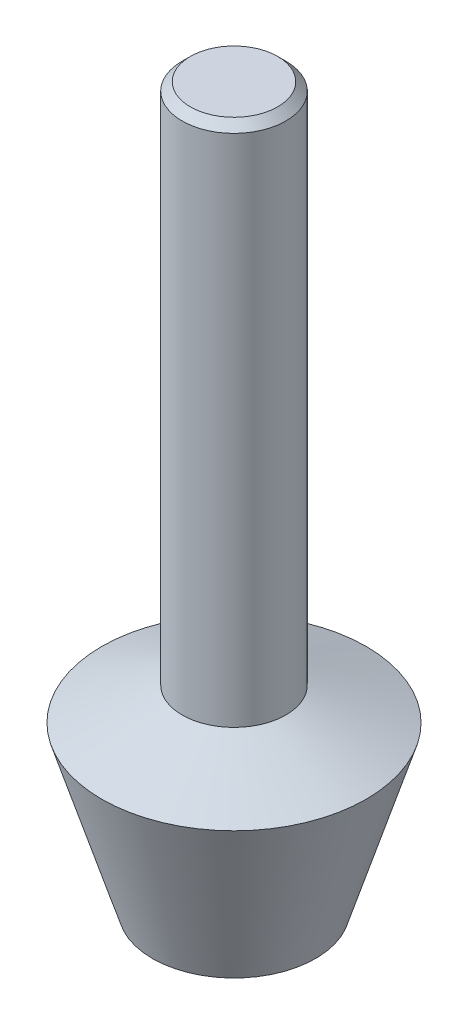
ISO-10303-21;
HEADER;
FILE_DESCRIPTION(('STEP AP214'),'2;1');
FILE_NAME('part.step','',(''),(''),'','','');
FILE_SCHEMA(('AUTOMOTIVE_DESIGN { 1 0 10303 214 1 1 1 1 }'));
ENDSEC;
DATA;
#1=APPLICATION_CONTEXT('core data for automotive mechanical design processes');
#2=APPLICATION_PROTOCOL_DEFINITION('international standard','automotive_design',2000,#1);
#3=PRODUCT_CONTEXT('',#1,'mechanical');
#4=PRODUCT('Part','Part','',(#3));
#5=PRODUCT_RELATED_PRODUCT_CATEGORY('part','',(#4));
#6=PRODUCT_DEFINITION_FORMATION('','',#4);
#7=PRODUCT_DEFINITION_CONTEXT('part definition',#1,'design');
#8=PRODUCT_DEFINITION('design','',#6,#7);
#9=PRODUCT_DEFINITION_SHAPE('','',#8);
#10=(LENGTH_UNIT() NAMED_UNIT(*) SI_UNIT(.MILLI.,.METRE.));
#11=(NAMED_UNIT(*) PLANE_ANGLE_UNIT() SI_UNIT($,.RADIAN.));
#12=(NAMED_UNIT(*) SI_UNIT($,.STERADIAN.) SOLID_ANGLE_UNIT());
#13=UNCERTAINTY_MEASURE_WITH_UNIT(LENGTH_MEASURE(1.E-05),#10,'distance_accuracy_value','');
#14=(GEOMETRIC_REPRESENTATION_CONTEXT(3) GLOBAL_UNCERTAINTY_ASSIGNED_CONTEXT((#13)) GLOBAL_UNIT_ASSIGNED_CONTEXT((#10,
#11,#12)) REPRESENTATION_CONTEXT('',''));
#15=CARTESIAN_POINT('',(0.,0.,0.));
#16=DIRECTION('',(0.,0.,1.));
#17=DIRECTION('',(1.,0.,0.));
#18=AXIS2_PLACEMENT_3D('',#15,#16,#17);
#19=CARTESIAN_POINT('',(-5.06,0.,5.06));
#20=DIRECTION('',(0.,-1.,0.));
#21=DIRECTION('',(0.,0.,-1.));
#22=AXIS2_PLACEMENT_3D('',#19,#20,#21);
#23=PLANE('',#22);
#24=CARTESIAN_POINT('',(0.,0.,0.));
#25=DIRECTION('',(0.,1.,0.));
#26=DIRECTION('',(0.,0.,1.));
#27=AXIS2_PLACEMENT_3D('',#24,#25,#26);
#28=CIRCLE('',#27,5.);
#29=CARTESIAN_POINT('',(0.,0.,5.));
#30=VERTEX_POINT('',#29);
#31=EDGE_CURVE('E18',#30,#30,#28,.F.);
#32=ORIENTED_EDGE('',*,*,#31,.T.);
#33=EDGE_LOOP('',(#32));
#34=FACE_BOUND('',#33,.T.);
#35=ADVANCED_FACE('F14',(#34),#23,.T.);
#36=CARTESIAN_POINT('',(0.,0.,0.));
#37=DIRECTION('',(0.,1.,0.));
#38=DIRECTION('',(0.,0.,1.));
#39=AXIS2_PLACEMENT_3D('',#36,#37,#38);
#40=CONICAL_SURFACE('',#39,5.,0.300605670042395);
#41=CARTESIAN_POINT('',(0.,10.,0.));
#42=DIRECTION('',(0.,-1.,0.));
#43=DIRECTION('',(0.,0.,-1.));
#44=AXIS2_PLACEMENT_3D('',#41,#42,#43);
#45=CIRCLE('',#44,8.1);
#46=CARTESIAN_POINT('',(0.,10.,-8.1));
#47=VERTEX_POINT('',#46);
#48=EDGE_CURVE('E29',#47,#47,#45,.T.);
#49=ORIENTED_EDGE('',*,*,#48,.T.);
#50=EDGE_LOOP('',(#49));
#51=FACE_BOUND('',#50,.T.);
#52=ORIENTED_EDGE('',*,*,#31,.F.);
#53=EDGE_LOOP('',(#52));
#54=FACE_BOUND('',#53,.T.);
#55=ADVANCED_FACE('F54',(#51,#54),#40,.T.);
#56=CARTESIAN_POINT('',(0.,12.,0.));
#57=DIRECTION('',(0.,-1.,0.));
#58=DIRECTION('',(0.,0.,-1.));
#59=AXIS2_PLACEMENT_3D('',#56,#57,#58);
#60=CONICAL_SURFACE('',#59,3.175,1.18504982297332);
#61=ORIENTED_EDGE('',*,*,#48,.F.);
#62=EDGE_LOOP('',(#61));
#63=FACE_BOUND('',#62,.T.);
#64=CARTESIAN_POINT('',(0.,12.,0.));
#65=DIRECTION('',(0.,-1.,0.));
#66=DIRECTION('',(0.,0.,-1.));
#67=AXIS2_PLACEMENT_3D('',#64,#65,#66);
#68=CIRCLE('',#67,3.175);
#69=CARTESIAN_POINT('',(0.,12.,-3.175));
#70=VERTEX_POINT('',#69);
#71=EDGE_CURVE('E26',#70,#70,#68,.T.);
#72=ORIENTED_EDGE('',*,*,#71,.T.);
#73=EDGE_LOOP('',(#72));
#74=FACE_BOUND('',#73,.T.);
#75=ADVANCED_FACE('F35',(#63,#74),#60,.T.);
#76=CARTESIAN_POINT('',(0.,43.5,0.));
#77=DIRECTION('',(0.,-1.,0.));
#78=DIRECTION('',(0.,0.,-1.));
#79=AXIS2_PLACEMENT_3D('',#76,#77,#78);
#80=CYLINDRICAL_SURFACE('',#79,3.175);
#81=ORIENTED_EDGE('',*,*,#71,.F.);
#82=EDGE_LOOP('',(#81));
#83=FACE_BOUND('',#82,.T.);
#84=CARTESIAN_POINT('',(0.,43.5000000000001,0.));
#85=DIRECTION('',(0.,-1.,0.));
#86=DIRECTION('',(0.,0.,-1.));
#87=AXIS2_PLACEMENT_3D('',#84,#85,#86);
#88=CIRCLE('',#87,3.175);
#89=CARTESIAN_POINT('',(0.,43.5,-3.175));
#90=VERTEX_POINT('',#89);
#91=EDGE_CURVE('E22',#90,#90,#88,.T.);
#92=ORIENTED_EDGE('',*,*,#91,.T.);
#93=EDGE_LOOP('',(#92));
#94=FACE_BOUND('',#93,.T.);
#95=ADVANCED_FACE('F37',(#83,#94),#80,.T.);
#96=CARTESIAN_POINT('',(-2.7071,44.,-2.7071));
#97=DIRECTION('',(0.,1.,0.));
#98=DIRECTION('',(0.,0.,1.));
#99=AXIS2_PLACEMENT_3D('',#96,#97,#98);
#100=PLANE('',#99);
#101=CARTESIAN_POINT('',(0.,44.,0.));
#102=DIRECTION('',(0.,-1.,0.));
#103=DIRECTION('',(0.,0.,-1.));
#104=AXIS2_PLACEMENT_3D('',#101,#102,#103);
#105=CIRCLE('',#104,2.67499999999995);
#106=CARTESIAN_POINT('',(0.,44.,-2.67499999999995));
#107=VERTEX_POINT('',#106);
#108=EDGE_CURVE('E10',#107,#107,#105,.F.);
#109=ORIENTED_EDGE('',*,*,#108,.T.);
#110=EDGE_LOOP('',(#109));
#111=FACE_BOUND('',#110,.T.);
#112=ADVANCED_FACE('F16',(#111),#100,.T.);
#113=CARTESIAN_POINT('',(0.,44.,0.));
#114=DIRECTION('',(0.,-1.,0.));
#115=DIRECTION('',(0.,0.,-1.));
#116=AXIS2_PLACEMENT_3D('',#113,#114,#115);
#117=CONICAL_SURFACE('',#116,2.675,0.785398163397455);
#118=ORIENTED_EDGE('',*,*,#108,.F.);
#119=EDGE_LOOP('',(#118));
#120=FACE_BOUND('',#119,.T.);
#121=ORIENTED_EDGE('',*,*,#91,.F.);
#122=EDGE_LOOP('',(#121));
#123=FACE_BOUND('',#122,.T.);
#124=ADVANCED_FACE('F43',(#120,#123),#117,.T.);
#125=CLOSED_SHELL('',(#35,#55,#75,#95,#112,#124));
#126=MANIFOLD_SOLID_BREP('B1',#125);
#127=ADVANCED_BREP_SHAPE_REPRESENTATION('',(#18,#126),#14);
#128=SHAPE_DEFINITION_REPRESENTATION(#9,#127);
ENDSEC;
END-ISO-10303-21;
